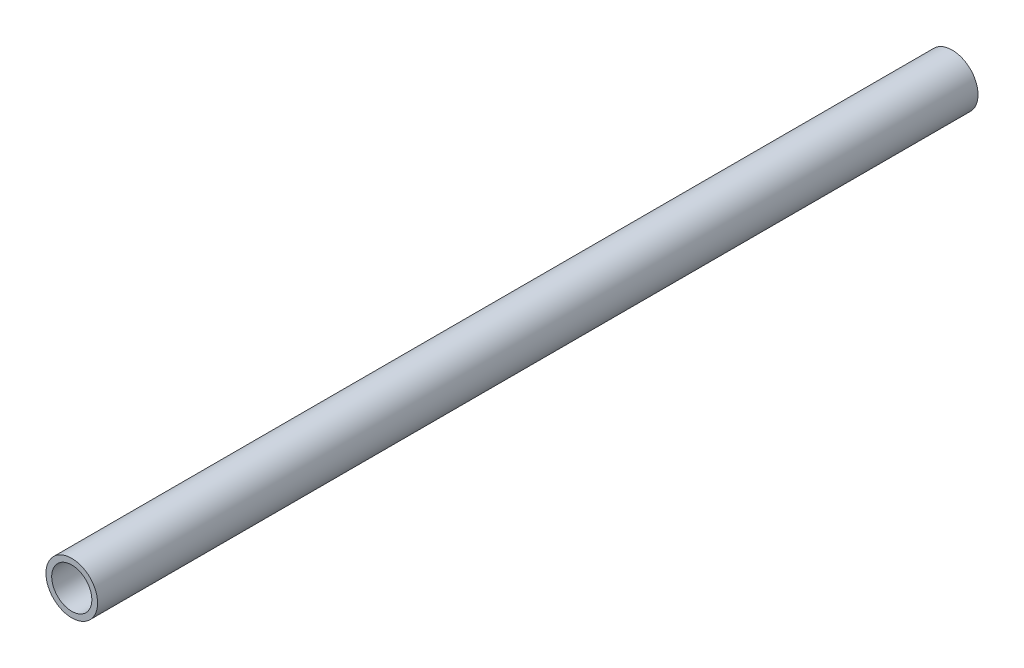
ISO-10303-21;
HEADER;
FILE_DESCRIPTION(('STEP AP214'),'2;1');
FILE_NAME('part.step','',(''),(''),'','','');
FILE_SCHEMA(('AUTOMOTIVE_DESIGN { 1 0 10303 214 1 1 1 1 }'));
ENDSEC;
DATA;
#1=APPLICATION_CONTEXT('core data for automotive mechanical design processes');
#2=APPLICATION_PROTOCOL_DEFINITION('international standard','automotive_design',2000,#1);
#3=PRODUCT_CONTEXT('',#1,'mechanical');
#4=PRODUCT('Part','Part','',(#3));
#5=PRODUCT_RELATED_PRODUCT_CATEGORY('part','',(#4));
#6=PRODUCT_DEFINITION_FORMATION('','',#4);
#7=PRODUCT_DEFINITION_CONTEXT('part definition',#1,'design');
#8=PRODUCT_DEFINITION('design','',#6,#7);
#9=PRODUCT_DEFINITION_SHAPE('','',#8);
#10=(LENGTH_UNIT() NAMED_UNIT(*) SI_UNIT(.MILLI.,.METRE.));
#11=(NAMED_UNIT(*) PLANE_ANGLE_UNIT() SI_UNIT($,.RADIAN.));
#12=(NAMED_UNIT(*) SI_UNIT($,.STERADIAN.) SOLID_ANGLE_UNIT());
#13=UNCERTAINTY_MEASURE_WITH_UNIT(LENGTH_MEASURE(1.E-05),#10,'distance_accuracy_value','');
#14=(GEOMETRIC_REPRESENTATION_CONTEXT(3) GLOBAL_UNCERTAINTY_ASSIGNED_CONTEXT((#13)) GLOBAL_UNIT_ASSIGNED_CONTEXT((#10,
#11,#12)) REPRESENTATION_CONTEXT('',''));
#15=CARTESIAN_POINT('',(0.,0.,0.));
#16=DIRECTION('',(0.,0.,1.));
#17=DIRECTION('',(1.,0.,0.));
#18=AXIS2_PLACEMENT_3D('',#15,#16,#17);
#19=CARTESIAN_POINT('',(0.,0.,306.9));
#20=DIRECTION('',(0.,0.,1.));
#21=DIRECTION('',(1.,0.,0.));
#22=AXIS2_PLACEMENT_3D('',#19,#20,#21);
#23=PLANE('',#22);
#24=CARTESIAN_POINT('',(0.,0.,306.9));
#25=DIRECTION('',(0.,0.,1.));
#26=DIRECTION('',(1.,0.,0.));
#27=AXIS2_PLACEMENT_3D('',#24,#25,#26);
#28=CIRCLE('',#27,9.);
#29=CARTESIAN_POINT('',(9.,0.,306.9));
#30=VERTEX_POINT('',#29);
#31=EDGE_CURVE('E10',#30,#30,#28,.T.);
#32=ORIENTED_EDGE('',*,*,#31,.T.);
#33=EDGE_LOOP('',(#32));
#34=FACE_BOUND('',#33,.T.);
#35=CARTESIAN_POINT('',(0.,0.,306.9));
#36=DIRECTION('',(0.,0.,1.));
#37=DIRECTION('',(1.,0.,0.));
#38=AXIS2_PLACEMENT_3D('',#35,#36,#37);
#39=CIRCLE('',#38,7.);
#40=CARTESIAN_POINT('',(7.,0.,306.9));
#41=VERTEX_POINT('',#40);
#42=EDGE_CURVE('E50',#41,#41,#39,.T.);
#43=ORIENTED_EDGE('',*,*,#42,.F.);
#44=EDGE_LOOP('',(#43));
#45=FACE_BOUND('',#44,.T.);
#46=ADVANCED_FACE('F37',(#34,#45),#23,.T.);
#47=CARTESIAN_POINT('',(0.,0.,0.));
#48=DIRECTION('',(0.,0.,1.));
#49=DIRECTION('',(1.,0.,0.));
#50=AXIS2_PLACEMENT_3D('',#47,#48,#49);
#51=PLANE('',#50);
#52=CARTESIAN_POINT('',(0.,0.,0.));
#53=DIRECTION('',(0.,0.,1.));
#54=DIRECTION('',(1.,0.,0.));
#55=AXIS2_PLACEMENT_3D('',#52,#53,#54);
#56=CIRCLE('',#55,9.);
#57=CARTESIAN_POINT('',(9.,0.,0.));
#58=VERTEX_POINT('',#57);
#59=EDGE_CURVE('E41',#58,#58,#56,.T.);
#60=ORIENTED_EDGE('',*,*,#59,.F.);
#61=EDGE_LOOP('',(#60));
#62=FACE_BOUND('',#61,.T.);
#63=CARTESIAN_POINT('',(0.,0.,0.));
#64=DIRECTION('',(0.,0.,1.));
#65=DIRECTION('',(1.,0.,0.));
#66=AXIS2_PLACEMENT_3D('',#63,#64,#65);
#67=CIRCLE('',#66,7.);
#68=CARTESIAN_POINT('',(7.,0.,0.));
#69=VERTEX_POINT('',#68);
#70=EDGE_CURVE('E52',#69,#69,#67,.T.);
#71=ORIENTED_EDGE('',*,*,#70,.T.);
#72=EDGE_LOOP('',(#71));
#73=FACE_BOUND('',#72,.T.);
#74=ADVANCED_FACE('F64',(#62,#73),#51,.F.);
#75=CARTESIAN_POINT('',(0.,0.,306.9));
#76=DIRECTION('',(0.,0.,-1.));
#77=DIRECTION('',(-1.,0.,0.));
#78=AXIS2_PLACEMENT_3D('',#75,#76,#77);
#79=CYLINDRICAL_SURFACE('',#78,9.);
#80=ORIENTED_EDGE('',*,*,#31,.F.);
#81=EDGE_LOOP('',(#80));
#82=FACE_BOUND('',#81,.T.);
#83=ORIENTED_EDGE('',*,*,#59,.T.);
#84=EDGE_LOOP('',(#83));
#85=FACE_BOUND('',#84,.T.);
#86=ADVANCED_FACE('F39',(#82,#85),#79,.T.);
#87=CARTESIAN_POINT('',(0.,0.,306.9));
#88=DIRECTION('',(0.,0.,-1.));
#89=DIRECTION('',(-1.,0.,0.));
#90=AXIS2_PLACEMENT_3D('',#87,#88,#89);
#91=CYLINDRICAL_SURFACE('',#90,7.);
#92=ORIENTED_EDGE('',*,*,#42,.T.);
#93=EDGE_LOOP('',(#92));
#94=FACE_BOUND('',#93,.T.);
#95=ORIENTED_EDGE('',*,*,#70,.F.);
#96=EDGE_LOOP('',(#95));
#97=FACE_BOUND('',#96,.T.);
#98=ADVANCED_FACE('F60',(#94,#97),#91,.F.);
#99=CLOSED_SHELL('',(#46,#74,#86,#98));
#100=MANIFOLD_SOLID_BREP('B2',#99);
#101=ADVANCED_BREP_SHAPE_REPRESENTATION('',(#18,#100),#14);
#102=SHAPE_DEFINITION_REPRESENTATION(#9,#101);
ENDSEC;
END-ISO-10303-21;
